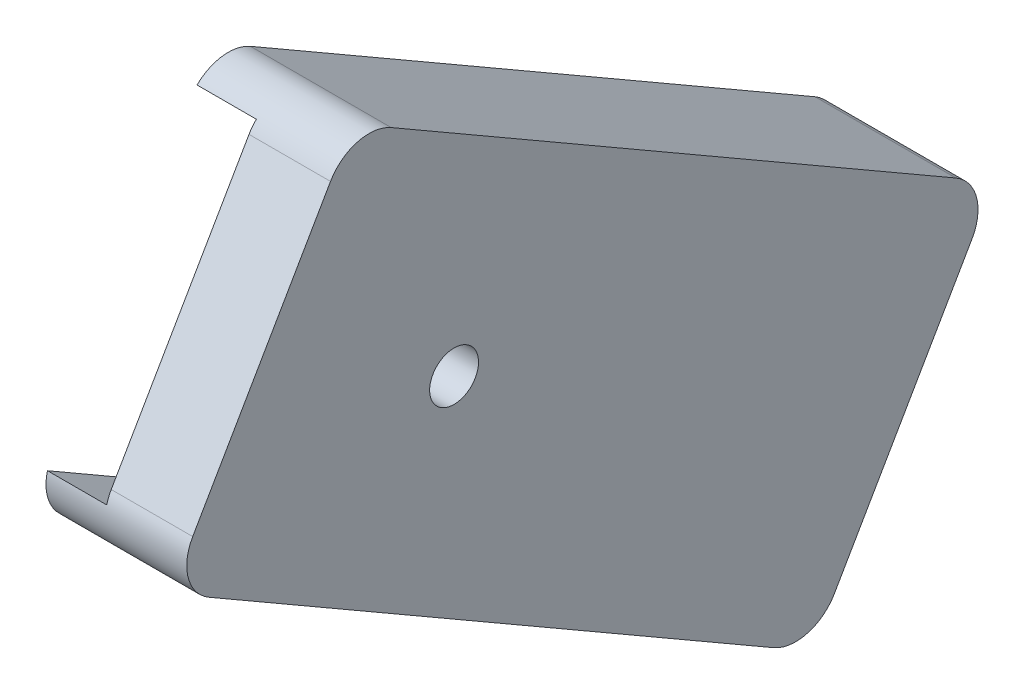
ISO-10303-21;
HEADER;
FILE_DESCRIPTION(('STEP AP214'),'2;1');
FILE_NAME('part.step','',(''),(''),'','','');
FILE_SCHEMA(('AUTOMOTIVE_DESIGN { 1 0 10303 214 1 1 1 1 }'));
ENDSEC;
DATA;
#1=APPLICATION_CONTEXT('core data for automotive mechanical design processes');
#2=APPLICATION_PROTOCOL_DEFINITION('international standard','automotive_design',2000,#1);
#3=PRODUCT_CONTEXT('',#1,'mechanical');
#4=PRODUCT('Part','Part','',(#3));
#5=PRODUCT_RELATED_PRODUCT_CATEGORY('part','',(#4));
#6=PRODUCT_DEFINITION_FORMATION('','',#4);
#7=PRODUCT_DEFINITION_CONTEXT('part definition',#1,'design');
#8=PRODUCT_DEFINITION('design','',#6,#7);
#9=PRODUCT_DEFINITION_SHAPE('','',#8);
#10=(LENGTH_UNIT() NAMED_UNIT(*) SI_UNIT(.MILLI.,.METRE.));
#11=(NAMED_UNIT(*) PLANE_ANGLE_UNIT() SI_UNIT($,.RADIAN.));
#12=(NAMED_UNIT(*) SI_UNIT($,.STERADIAN.) SOLID_ANGLE_UNIT());
#13=UNCERTAINTY_MEASURE_WITH_UNIT(LENGTH_MEASURE(1.E-05),#10,'distance_accuracy_value','');
#14=(GEOMETRIC_REPRESENTATION_CONTEXT(3) GLOBAL_UNCERTAINTY_ASSIGNED_CONTEXT((#13)) GLOBAL_UNIT_ASSIGNED_CONTEXT((#10,
#11,#12)) REPRESENTATION_CONTEXT('',''));
#15=CARTESIAN_POINT('',(0.,0.,0.));
#16=DIRECTION('',(0.,0.,1.));
#17=DIRECTION('',(1.,0.,0.));
#18=AXIS2_PLACEMENT_3D('',#15,#16,#17);
#19=CARTESIAN_POINT('',(-155.706722270034,-0.259618271787454,286.750320906195));
#20=DIRECTION('',(0.,0.5,0.866025403784439));
#21=DIRECTION('',(0.,-0.866025403784439,0.5));
#22=AXIS2_PLACEMENT_3D('',#19,#20,#21);
#23=PLANE('',#22);
#24=DIRECTION('',(0.,-0.866025403784439,0.5));
#25=VECTOR('',#24,1.);
#26=CARTESIAN_POINT('',(-161.206722270034,-0.259618271787454,286.750320906195));
#27=LINE('',#26,#25);
#28=CARTESIAN_POINT('',(-161.206722270034,-0.606028433301191,286.950320906195));
#29=VERTEX_POINT('',#28);
#30=CARTESIAN_POINT('',(-161.206722270034,-16.7141009436918,296.250320906195));
#31=VERTEX_POINT('',#30);
#32=EDGE_CURVE('E159',#29,#31,#27,.T.);
#33=ORIENTED_EDGE('',*,*,#32,.T.);
#34=DIRECTION('',(1.,0.,0.));
#35=VECTOR('',#34,1.);
#36=CARTESIAN_POINT('',(-155.706722270034,-16.7141009436918,296.250320906195));
#37=LINE('',#36,#35);
#38=CARTESIAN_POINT('',(-155.706722270034,-16.7141009436918,296.250320906195));
#39=VERTEX_POINT('',#38);
#40=EDGE_CURVE('E150',#31,#39,#37,.T.);
#41=ORIENTED_EDGE('',*,*,#40,.T.);
#42=DIRECTION('',(0.,-0.866025403784439,0.5));
#43=VECTOR('',#42,1.);
#44=CARTESIAN_POINT('',(-155.706722270034,-0.259618271787454,286.750320906195));
#45=LINE('',#44,#43);
#46=CARTESIAN_POINT('',(-155.706722270034,-0.606028433301191,286.950320906195));
#47=VERTEX_POINT('',#46);
#48=EDGE_CURVE('E141',#47,#39,#45,.T.);
#49=ORIENTED_EDGE('',*,*,#48,.F.);
#50=DIRECTION('',(1.,0.,0.));
#51=VECTOR('',#50,1.);
#52=CARTESIAN_POINT('',(-155.706722270034,-0.606028433301192,286.950320906195));
#53=LINE('',#52,#51);
#54=EDGE_CURVE('E155',#47,#29,#53,.F.);
#55=ORIENTED_EDGE('',*,*,#54,.T.);
#56=EDGE_LOOP('',(#33,#41,#49,#55));
#57=FACE_BOUND('',#56,.T.);
#58=ADVANCED_FACE('F48',(#57),#23,.T.);
#59=CARTESIAN_POINT('',(-155.706722270034,-82.5342316635769,162.346510338529));
#60=DIRECTION('',(1.,0.,0.));
#61=DIRECTION('',(0.,-1.,0.));
#62=AXIS2_PLACEMENT_3D('',#59,#60,#61);
#63=PLANE('',#62);
#64=CARTESIAN_POINT('',(-155.706722270034,-16.1600646884965,278.609939849428));
#65=DIRECTION('',(1.,0.,0.));
#66=DIRECTION('',(0.,-0.5,-0.866025403784439));
#67=AXIS2_PLACEMENT_3D('',#64,#65,#66);
#68=CIRCLE('',#67,1.65);
#69=CARTESIAN_POINT('',(-155.706722270034,-16.9850646884965,277.180997933184));
#70=VERTEX_POINT('',#69);
#71=EDGE_CURVE('E261',#70,#70,#68,.T.);
#72=ORIENTED_EDGE('',*,*,#71,.F.);
#73=EDGE_LOOP('',(#72));
#74=FACE_BOUND('',#73,.T.);
#75=ORIENTED_EDGE('',*,*,#48,.T.);
#76=CARTESIAN_POINT('',(-155.706722270034,-18.2141009436918,293.652244694842));
#77=DIRECTION('',(1.,0.,0.));
#78=DIRECTION('',(0.,0.,-1.));
#79=AXIS2_PLACEMENT_3D('',#76,#77,#78);
#80=CIRCLE('',#79,3.);
#81=CARTESIAN_POINT('',(-155.706722270034,-20.8121771550451,295.152244694842));
#82=VERTEX_POINT('',#81);
#83=EDGE_CURVE('E176',#39,#82,#80,.T.);
#84=ORIENTED_EDGE('',*,*,#83,.T.);
#85=DIRECTION('',(0.,0.5,0.866025403784439));
#86=VECTOR('',#85,1.);
#87=CARTESIAN_POINT('',(-155.706722270034,-31.8121771550451,276.099685811584));
#88=LINE('',#87,#86);
#89=CARTESIAN_POINT('',(-155.706722270034,-42.8121771550451,257.047126928326));
#90=VERTEX_POINT('',#89);
#91=EDGE_CURVE('E253',#90,#82,#88,.T.);
#92=ORIENTED_EDGE('',*,*,#91,.F.);
#93=CARTESIAN_POINT('',(-155.706722270034,-40.2141009436918,255.547126928326));
#94=DIRECTION('',(1.,0.,0.));
#95=DIRECTION('',(0.,0.,-1.));
#96=AXIS2_PLACEMENT_3D('',#93,#94,#95);
#97=CIRCLE('',#96,3.);
#98=CARTESIAN_POINT('',(-155.706722270034,-41.7141009436918,252.949050716973));
#99=VERTEX_POINT('',#98);
#100=EDGE_CURVE('E173',#90,#99,#97,.T.);
#101=ORIENTED_EDGE('',*,*,#100,.T.);
#102=DIRECTION('',(0.,-0.866025403784439,0.5));
#103=VECTOR('',#102,1.);
#104=CARTESIAN_POINT('',(-155.706722270034,-33.6600646884965,248.299050716973));
#105=LINE('',#104,#103);
#106=CARTESIAN_POINT('',(-155.706722270034,-25.6060284333012,243.649050716973));
#107=VERTEX_POINT('',#106);
#108=EDGE_CURVE('E265',#107,#99,#105,.T.);
#109=ORIENTED_EDGE('',*,*,#108,.F.);
#110=CARTESIAN_POINT('',(-155.706722270034,-24.1060284333012,246.247126928326));
#111=DIRECTION('',(1.,0.,0.));
#112=DIRECTION('',(0.,0.,-1.));
#113=AXIS2_PLACEMENT_3D('',#110,#111,#112);
#114=CIRCLE('',#113,3.);
#115=CARTESIAN_POINT('',(-155.706722270034,-21.5079522219479,244.747126928326));
#116=VERTEX_POINT('',#115);
#117=EDGE_CURVE('E149',#107,#116,#114,.T.);
#118=ORIENTED_EDGE('',*,*,#117,.T.);
#119=DIRECTION('',(0.,0.5,0.866025403784439));
#120=VECTOR('',#119,1.);
#121=CARTESIAN_POINT('',(-155.706722270034,-10.5079522219479,263.799685811584));
#122=LINE('',#121,#120);
#123=CARTESIAN_POINT('',(-155.706722270034,0.492047778052103,282.852244694842));
#124=VERTEX_POINT('',#123);
#125=EDGE_CURVE('E143',#116,#124,#122,.T.);
#126=ORIENTED_EDGE('',*,*,#125,.T.);
#127=CARTESIAN_POINT('',(-155.706722270034,-2.1060284333012,284.352244694842));
#128=DIRECTION('',(1.,0.,0.));
#129=DIRECTION('',(0.,0.,-1.));
#130=AXIS2_PLACEMENT_3D('',#127,#128,#129);
#131=CIRCLE('',#130,3.);
#132=EDGE_CURVE('E138',#124,#47,#131,.T.);
#133=ORIENTED_EDGE('',*,*,#132,.T.);
#134=EDGE_LOOP('',(#75,#84,#92,#101,#109,#118,#126,#133));
#135=FACE_BOUND('',#134,.T.);
#136=ADVANCED_FACE('F140',(#74,#135),#63,.T.);
#137=CARTESIAN_POINT('',(-155.706722270034,-33.6600646884965,248.299050716973));
#138=DIRECTION('',(0.,0.5,0.866025403784439));
#139=DIRECTION('',(0.,-0.866025403784439,0.5));
#140=AXIS2_PLACEMENT_3D('',#137,#138,#139);
#141=PLANE('',#140);
#142=ORIENTED_EDGE('',*,*,#108,.T.);
#143=DIRECTION('',(1.,0.,0.));
#144=VECTOR('',#143,1.);
#145=CARTESIAN_POINT('',(-155.706722270034,-41.7141009436918,252.949050716973));
#146=LINE('',#145,#144);
#147=CARTESIAN_POINT('',(-161.206722270034,-41.7141009436918,252.949050716973));
#148=VERTEX_POINT('',#147);
#149=EDGE_CURVE('E213',#99,#148,#146,.F.);
#150=ORIENTED_EDGE('',*,*,#149,.T.);
#151=DIRECTION('',(0.,-0.866025403784439,0.5));
#152=VECTOR('',#151,1.);
#153=CARTESIAN_POINT('',(-161.206722270034,-33.6600646884965,248.299050716973));
#154=LINE('',#153,#152);
#155=CARTESIAN_POINT('',(-161.206722270034,-25.6060284333012,243.649050716973));
#156=VERTEX_POINT('',#155);
#157=EDGE_CURVE('E269',#156,#148,#154,.T.);
#158=ORIENTED_EDGE('',*,*,#157,.F.);
#159=DIRECTION('',(1.,0.,0.));
#160=VECTOR('',#159,1.);
#161=CARTESIAN_POINT('',(-155.706722270034,-25.6060284333012,243.649050716973));
#162=LINE('',#161,#160);
#163=EDGE_CURVE('E209',#156,#107,#162,.T.);
#164=ORIENTED_EDGE('',*,*,#163,.T.);
#165=EDGE_LOOP('',(#142,#150,#158,#164));
#166=FACE_BOUND('',#165,.T.);
#167=ADVANCED_FACE('F295',(#166),#141,.F.);
#168=CARTESIAN_POINT('',(-155.706722270034,-16.1600646884965,278.609939849428));
#169=DIRECTION('',(-1.,0.,0.));
#170=DIRECTION('',(0.,1.,0.));
#171=AXIS2_PLACEMENT_3D('',#168,#169,#170);
#172=CYLINDRICAL_SURFACE('',#171,1.65);
#173=ORIENTED_EDGE('',*,*,#71,.T.);
#174=EDGE_LOOP('',(#173));
#175=FACE_BOUND('',#174,.T.);
#176=CARTESIAN_POINT('',(-161.206722270034,-16.1600646884965,278.609939849428));
#177=DIRECTION('',(1.,0.,0.));
#178=DIRECTION('',(0.,-0.5,-0.866025403784439));
#179=AXIS2_PLACEMENT_3D('',#176,#177,#178);
#180=CIRCLE('',#179,1.65);
#181=CARTESIAN_POINT('',(-161.206722270034,-16.9850646884965,277.180997933184));
#182=VERTEX_POINT('',#181);
#183=EDGE_CURVE('E257',#182,#182,#180,.T.);
#184=ORIENTED_EDGE('',*,*,#183,.F.);
#185=EDGE_LOOP('',(#184));
#186=FACE_BOUND('',#185,.T.);
#187=ADVANCED_FACE('F411',(#175,#186),#172,.F.);
#188=CARTESIAN_POINT('',(-161.206722270034,-82.5342316635769,162.346510338529));
#189=DIRECTION('',(1.,0.,0.));
#190=DIRECTION('',(0.,-1.,0.));
#191=AXIS2_PLACEMENT_3D('',#188,#189,#190);
#192=PLANE('',#191);
#193=ORIENTED_EDGE('',*,*,#183,.T.);
#194=EDGE_LOOP('',(#193));
#195=FACE_BOUND('',#194,.T.);
#196=DIRECTION('',(0.,0.5,0.866025403784438));
#197=VECTOR('',#196,1.);
#198=CARTESIAN_POINT('',(-161.206722270034,-29.9069212667194,274.999685811584));
#199=LINE('',#198,#197);
#200=CARTESIAN_POINT('',(-161.206722270034,-42.3526044961995,253.443130123217));
#201=VERTEX_POINT('',#200);
#202=CARTESIAN_POINT('',(-161.206722270034,-17.4612380372392,296.556241499951));
#203=VERTEX_POINT('',#202);
#204=EDGE_CURVE('E246',#201,#203,#199,.T.);
#205=ORIENTED_EDGE('',*,*,#204,.T.);
#206=CARTESIAN_POINT('',(-161.206722270034,-18.2141009436918,293.652244694842));
#207=DIRECTION('',(1.,0.,0.));
#208=DIRECTION('',(0.,0.,-1.));
#209=AXIS2_PLACEMENT_3D('',#206,#207,#208);
#210=CIRCLE('',#209,3.);
#211=EDGE_CURVE('E206',#203,#31,#210,.F.);
#212=ORIENTED_EDGE('',*,*,#211,.T.);
#213=ORIENTED_EDGE('',*,*,#32,.F.);
#214=CARTESIAN_POINT('',(-161.206722270034,-2.1060284333012,284.352244694842));
#215=DIRECTION('',(1.,0.,0.));
#216=DIRECTION('',(0.,0.,-1.));
#217=AXIS2_PLACEMENT_3D('',#214,#215,#216);
#218=CIRCLE('',#217,3.);
#219=CARTESIAN_POINT('',(-161.206722270034,0.0324751192064127,286.456241499951));
#220=VERTEX_POINT('',#219);
#221=EDGE_CURVE('E162',#29,#220,#218,.F.);
#222=ORIENTED_EDGE('',*,*,#221,.T.);
#223=DIRECTION('',(0.,0.5,0.866025403784438));
#224=VECTOR('',#223,1.);
#225=CARTESIAN_POINT('',(-161.206722270034,-12.4132081102737,264.899685811584));
#226=LINE('',#225,#224);
#227=CARTESIAN_POINT('',(-161.206722270034,-24.8588913397538,243.343130123217));
#228=VERTEX_POINT('',#227);
#229=EDGE_CURVE('E250',#228,#220,#226,.T.);
#230=ORIENTED_EDGE('',*,*,#229,.F.);
#231=CARTESIAN_POINT('',(-161.206722270034,-24.1060284333012,246.247126928326));
#232=DIRECTION('',(1.,0.,0.));
#233=DIRECTION('',(0.,0.,-1.));
#234=AXIS2_PLACEMENT_3D('',#231,#232,#233);
#235=CIRCLE('',#234,3.);
#236=EDGE_CURVE('E200',#228,#156,#235,.F.);
#237=ORIENTED_EDGE('',*,*,#236,.T.);
#238=ORIENTED_EDGE('',*,*,#157,.T.);
#239=CARTESIAN_POINT('',(-161.206722270034,-40.2141009436918,255.547126928326));
#240=DIRECTION('',(1.,0.,0.));
#241=DIRECTION('',(0.,0.,-1.));
#242=AXIS2_PLACEMENT_3D('',#239,#240,#241);
#243=CIRCLE('',#242,3.);
#244=EDGE_CURVE('E203',#148,#201,#243,.F.);
#245=ORIENTED_EDGE('',*,*,#244,.T.);
#246=EDGE_LOOP('',(#205,#212,#213,#222,#230,#237,#238,#245));
#247=FACE_BOUND('',#246,.T.);
#248=ADVANCED_FACE('F304',(#195,#247),#192,.F.);
#249=CARTESIAN_POINT('',(-155.704722270034,-29.9069212667194,274.999685811584));
#250=DIRECTION('',(0.,0.866025403784438,-0.5));
#251=DIRECTION('',(0.,0.5,0.866025403784438));
#252=AXIS2_PLACEMENT_3D('',#249,#250,#251);
#253=PLANE('',#252);
#254=DIRECTION('',(0.,0.5,0.866025403784438));
#255=VECTOR('',#254,1.);
#256=CARTESIAN_POINT('',(-165.206722270034,-29.9069212667194,274.999685811584));
#257=LINE('',#256,#255);
#258=CARTESIAN_POINT('',(-165.206722270034,-42.3526044961995,253.443130123217));
#259=VERTEX_POINT('',#258);
#260=CARTESIAN_POINT('',(-165.206722270034,-17.4612380372392,296.556241499951));
#261=VERTEX_POINT('',#260);
#262=EDGE_CURVE('E240',#259,#261,#257,.T.);
#263=ORIENTED_EDGE('',*,*,#262,.T.);
#264=DIRECTION('',(-1.,0.,0.));
#265=VECTOR('',#264,1.);
#266=CARTESIAN_POINT('',(-165.206722270034,-17.4612380372392,296.556241499951));
#267=LINE('',#266,#265);
#268=EDGE_CURVE('E195',#261,#203,#267,.F.);
#269=ORIENTED_EDGE('',*,*,#268,.T.);
#270=ORIENTED_EDGE('',*,*,#204,.F.);
#271=DIRECTION('',(1.,0.,0.));
#272=VECTOR('',#271,1.);
#273=CARTESIAN_POINT('',(-161.206722270034,-42.3526044961995,253.443130123217));
#274=LINE('',#273,#272);
#275=EDGE_CURVE('E192',#201,#259,#274,.F.);
#276=ORIENTED_EDGE('',*,*,#275,.T.);
#277=EDGE_LOOP('',(#263,#269,#270,#276));
#278=FACE_BOUND('',#277,.T.);
#279=ADVANCED_FACE('F308',(#278),#253,.T.);
#280=CARTESIAN_POINT('',(-155.704722270034,-31.8121771550451,276.099685811584));
#281=DIRECTION('',(0.,0.866025403784438,-0.5));
#282=DIRECTION('',(0.,0.5,0.866025403784439));
#283=AXIS2_PLACEMENT_3D('',#280,#281,#282);
#284=PLANE('',#283);
#285=ORIENTED_EDGE('',*,*,#91,.T.);
#286=DIRECTION('',(1.,0.,0.));
#287=VECTOR('',#286,1.);
#288=CARTESIAN_POINT('',(-165.206722270034,-20.8121771550451,295.152244694842));
#289=LINE('',#288,#287);
#290=CARTESIAN_POINT('',(-165.206722270034,-20.8121771550451,295.152244694842));
#291=VERTEX_POINT('',#290);
#292=EDGE_CURVE('E183',#82,#291,#289,.F.);
#293=ORIENTED_EDGE('',*,*,#292,.T.);
#294=DIRECTION('',(0.,0.5,0.866025403784438));
#295=VECTOR('',#294,1.);
#296=CARTESIAN_POINT('',(-165.206722270034,-31.8121771550451,276.099685811584));
#297=LINE('',#296,#295);
#298=CARTESIAN_POINT('',(-165.206722270034,-42.8121771550451,257.047126928326));
#299=VERTEX_POINT('',#298);
#300=EDGE_CURVE('E236',#299,#291,#297,.T.);
#301=ORIENTED_EDGE('',*,*,#300,.F.);
#302=DIRECTION('',(1.,0.,0.));
#303=VECTOR('',#302,1.);
#304=CARTESIAN_POINT('',(-155.704722270034,-42.8121771550451,257.047126928326));
#305=LINE('',#304,#303);
#306=EDGE_CURVE('E179',#299,#90,#305,.T.);
#307=ORIENTED_EDGE('',*,*,#306,.T.);
#308=EDGE_LOOP('',(#285,#293,#301,#307));
#309=FACE_BOUND('',#308,.T.);
#310=ADVANCED_FACE('F284',(#309),#284,.F.);
#311=CARTESIAN_POINT('',(-165.206722270034,-82.5342316635769,162.346510338529));
#312=DIRECTION('',(1.,0.,0.));
#313=DIRECTION('',(0.,-1.,0.));
#314=AXIS2_PLACEMENT_3D('',#311,#312,#313);
#315=PLANE('',#314);
#316=ORIENTED_EDGE('',*,*,#300,.T.);
#317=CARTESIAN_POINT('',(-165.206722270034,-18.2141009436918,293.652244694842));
#318=DIRECTION('',(1.,0.,0.));
#319=DIRECTION('',(0.,0.,-1.));
#320=AXIS2_PLACEMENT_3D('',#317,#318,#319);
#321=CIRCLE('',#320,3.);
#322=EDGE_CURVE('E189',#291,#261,#321,.F.);
#323=ORIENTED_EDGE('',*,*,#322,.T.);
#324=ORIENTED_EDGE('',*,*,#262,.F.);
#325=CARTESIAN_POINT('',(-165.206722270034,-40.2141009436918,255.547126928326));
#326=DIRECTION('',(1.,0.,0.));
#327=DIRECTION('',(0.,0.,-1.));
#328=AXIS2_PLACEMENT_3D('',#325,#326,#327);
#329=CIRCLE('',#328,3.);
#330=EDGE_CURVE('E186',#259,#299,#329,.F.);
#331=ORIENTED_EDGE('',*,*,#330,.T.);
#332=EDGE_LOOP('',(#316,#323,#324,#331));
#333=FACE_BOUND('',#332,.T.);
#334=ADVANCED_FACE('F310',(#333),#315,.F.);
#335=CARTESIAN_POINT('',(-155.704722270034,-12.4132081102737,264.899685811584));
#336=DIRECTION('',(0.,0.866025403784438,-0.5));
#337=DIRECTION('',(0.,0.5,0.866025403784438));
#338=AXIS2_PLACEMENT_3D('',#335,#336,#337);
#339=PLANE('',#338);
#340=DIRECTION('',(0.,0.5,0.866025403784438));
#341=VECTOR('',#340,1.);
#342=CARTESIAN_POINT('',(-165.206722270034,-12.4132081102737,264.899685811584));
#343=LINE('',#342,#341);
#344=CARTESIAN_POINT('',(-165.206722270034,-24.8588913397538,243.343130123217));
#345=VERTEX_POINT('',#344);
#346=CARTESIAN_POINT('',(-165.206722270034,0.0324751192064311,286.456241499951));
#347=VERTEX_POINT('',#346);
#348=EDGE_CURVE('E230',#345,#347,#343,.T.);
#349=ORIENTED_EDGE('',*,*,#348,.F.);
#350=DIRECTION('',(-1.,0.,0.));
#351=VECTOR('',#350,1.);
#352=CARTESIAN_POINT('',(-165.206722270034,-24.8588913397538,243.343130123217));
#353=LINE('',#352,#351);
#354=EDGE_CURVE('E11',#345,#228,#353,.F.);
#355=ORIENTED_EDGE('',*,*,#354,.T.);
#356=ORIENTED_EDGE('',*,*,#229,.T.);
#357=DIRECTION('',(1.,0.,0.));
#358=VECTOR('',#357,1.);
#359=CARTESIAN_POINT('',(-161.206722270034,0.0324751192064304,286.456241499951));
#360=LINE('',#359,#358);
#361=EDGE_CURVE('E57',#220,#347,#360,.F.);
#362=ORIENTED_EDGE('',*,*,#361,.T.);
#363=EDGE_LOOP('',(#349,#355,#356,#362));
#364=FACE_BOUND('',#363,.T.);
#365=ADVANCED_FACE('F303',(#364),#339,.F.);
#366=CARTESIAN_POINT('',(-165.206722270034,-82.5342316635769,162.346510338529));
#367=DIRECTION('',(1.,0.,0.));
#368=DIRECTION('',(0.,-1.,0.));
#369=AXIS2_PLACEMENT_3D('',#366,#367,#368);
#370=PLANE('',#369);
#371=DIRECTION('',(0.,0.5,0.866025403784439));
#372=VECTOR('',#371,1.);
#373=CARTESIAN_POINT('',(-165.206722270034,-10.5079522219479,263.799685811584));
#374=LINE('',#373,#372);
#375=CARTESIAN_POINT('',(-165.206722270034,-21.5079522219479,244.747126928326));
#376=VERTEX_POINT('',#375);
#377=CARTESIAN_POINT('',(-165.206722270034,0.492047778052103,282.852244694842));
#378=VERTEX_POINT('',#377);
#379=EDGE_CURVE('E168',#376,#378,#374,.T.);
#380=ORIENTED_EDGE('',*,*,#379,.F.);
#381=CARTESIAN_POINT('',(-165.206722270034,-24.1060284333012,246.247126928326));
#382=DIRECTION('',(1.,0.,0.));
#383=DIRECTION('',(0.,0.,-1.));
#384=AXIS2_PLACEMENT_3D('',#381,#382,#383);
#385=CIRCLE('',#384,3.);
#386=EDGE_CURVE('E70',#376,#345,#385,.F.);
#387=ORIENTED_EDGE('',*,*,#386,.T.);
#388=ORIENTED_EDGE('',*,*,#348,.T.);
#389=CARTESIAN_POINT('',(-165.206722270034,-2.1060284333012,284.352244694842));
#390=DIRECTION('',(1.,0.,0.));
#391=DIRECTION('',(0.,0.,-1.));
#392=AXIS2_PLACEMENT_3D('',#389,#390,#391);
#393=CIRCLE('',#392,3.);
#394=EDGE_CURVE('E222',#347,#378,#393,.F.);
#395=ORIENTED_EDGE('',*,*,#394,.T.);
#396=EDGE_LOOP('',(#380,#387,#388,#395));
#397=FACE_BOUND('',#396,.T.);
#398=ADVANCED_FACE('F229',(#397),#370,.F.);
#399=CARTESIAN_POINT('',(-155.704722270034,-10.5079522219479,263.799685811584));
#400=DIRECTION('',(0.,0.866025403784438,-0.5));
#401=DIRECTION('',(0.,0.5,0.866025403784439));
#402=AXIS2_PLACEMENT_3D('',#399,#400,#401);
#403=PLANE('',#402);
#404=ORIENTED_EDGE('',*,*,#125,.F.);
#405=DIRECTION('',(1.,0.,0.));
#406=VECTOR('',#405,1.);
#407=CARTESIAN_POINT('',(-165.206722270034,-21.5079522219479,244.747126928326));
#408=LINE('',#407,#406);
#409=EDGE_CURVE('E219',#116,#376,#408,.F.);
#410=ORIENTED_EDGE('',*,*,#409,.T.);
#411=ORIENTED_EDGE('',*,*,#379,.T.);
#412=DIRECTION('',(1.,0.,0.));
#413=VECTOR('',#412,1.);
#414=CARTESIAN_POINT('',(-155.704722270034,0.49204777805211,282.852244694842));
#415=LINE('',#414,#413);
#416=EDGE_CURVE('E216',#378,#124,#415,.T.);
#417=ORIENTED_EDGE('',*,*,#416,.T.);
#418=EDGE_LOOP('',(#404,#410,#411,#417));
#419=FACE_BOUND('',#418,.T.);
#420=ADVANCED_FACE('F232',(#419),#403,.T.);
#421=CARTESIAN_POINT('',(-155.706722270034,-18.2141009436918,293.652244694842));
#422=DIRECTION('',(-1.,0.,0.));
#423=DIRECTION('',(0.,0.,1.));
#424=AXIS2_PLACEMENT_3D('',#421,#422,#423);
#425=CYLINDRICAL_SURFACE('',#424,3.);
#426=ORIENTED_EDGE('',*,*,#322,.F.);
#427=ORIENTED_EDGE('',*,*,#292,.F.);
#428=ORIENTED_EDGE('',*,*,#83,.F.);
#429=ORIENTED_EDGE('',*,*,#40,.F.);
#430=ORIENTED_EDGE('',*,*,#211,.F.);
#431=ORIENTED_EDGE('',*,*,#268,.F.);
#432=EDGE_LOOP('',(#426,#427,#428,#429,#430,#431));
#433=FACE_BOUND('',#432,.T.);
#434=ADVANCED_FACE('F279',(#433),#425,.T.);
#435=CARTESIAN_POINT('',(-155.704722270034,-40.2141009436918,255.547126928326));
#436=DIRECTION('',(1.,0.,0.));
#437=DIRECTION('',(0.,0.,-1.));
#438=AXIS2_PLACEMENT_3D('',#435,#436,#437);
#439=CYLINDRICAL_SURFACE('',#438,3.);
#440=ORIENTED_EDGE('',*,*,#244,.F.);
#441=ORIENTED_EDGE('',*,*,#149,.F.);
#442=ORIENTED_EDGE('',*,*,#100,.F.);
#443=ORIENTED_EDGE('',*,*,#306,.F.);
#444=ORIENTED_EDGE('',*,*,#330,.F.);
#445=ORIENTED_EDGE('',*,*,#275,.F.);
#446=EDGE_LOOP('',(#440,#441,#442,#443,#444,#445));
#447=FACE_BOUND('',#446,.T.);
#448=ADVANCED_FACE('F290',(#447),#439,.T.);
#449=CARTESIAN_POINT('',(-155.706722270034,-24.1060284333012,246.247126928326));
#450=DIRECTION('',(-1.,0.,0.));
#451=DIRECTION('',(0.,0.,1.));
#452=AXIS2_PLACEMENT_3D('',#449,#450,#451);
#453=CYLINDRICAL_SURFACE('',#452,3.);
#454=ORIENTED_EDGE('',*,*,#386,.F.);
#455=ORIENTED_EDGE('',*,*,#409,.F.);
#456=ORIENTED_EDGE('',*,*,#117,.F.);
#457=ORIENTED_EDGE('',*,*,#163,.F.);
#458=ORIENTED_EDGE('',*,*,#236,.F.);
#459=ORIENTED_EDGE('',*,*,#354,.F.);
#460=EDGE_LOOP('',(#454,#455,#456,#457,#458,#459));
#461=FACE_BOUND('',#460,.T.);
#462=ADVANCED_FACE('F300',(#461),#453,.T.);
#463=CARTESIAN_POINT('',(-155.704722270034,-2.1060284333012,284.352244694842));
#464=DIRECTION('',(1.,0.,0.));
#465=DIRECTION('',(0.,0.,-1.));
#466=AXIS2_PLACEMENT_3D('',#463,#464,#465);
#467=CYLINDRICAL_SURFACE('',#466,3.);
#468=ORIENTED_EDGE('',*,*,#221,.F.);
#469=ORIENTED_EDGE('',*,*,#54,.F.);
#470=ORIENTED_EDGE('',*,*,#132,.F.);
#471=ORIENTED_EDGE('',*,*,#416,.F.);
#472=ORIENTED_EDGE('',*,*,#394,.F.);
#473=ORIENTED_EDGE('',*,*,#361,.F.);
#474=EDGE_LOOP('',(#468,#469,#470,#471,#472,#473));
#475=FACE_BOUND('',#474,.T.);
#476=ADVANCED_FACE('F50',(#475),#467,.T.);
#477=CLOSED_SHELL('',(#58,#136,#167,#187,#248,#279,#310,#334,#365,#398,#420,#434,#448,#462,#476));
#478=MANIFOLD_SOLID_BREP('B2',#477);
#479=ADVANCED_BREP_SHAPE_REPRESENTATION('',(#18,#478),#14);
#480=SHAPE_DEFINITION_REPRESENTATION(#9,#479);
ENDSEC;
END-ISO-10303-21;
